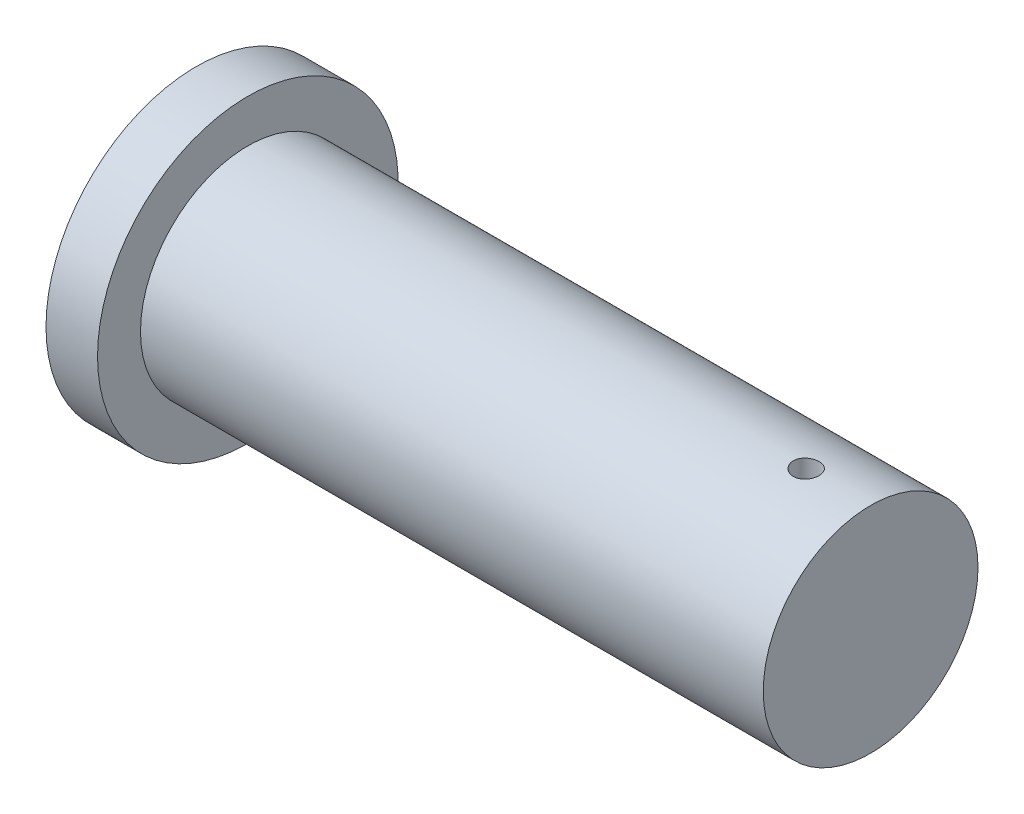
ISO-10303-21;
HEADER;
FILE_DESCRIPTION(('STEP AP214'),'2;1');
FILE_NAME('part.step','',(''),(''),'','','');
FILE_SCHEMA(('AUTOMOTIVE_DESIGN { 1 0 10303 214 1 1 1 1 }'));
ENDSEC;
DATA;
#1=APPLICATION_CONTEXT('core data for automotive mechanical design processes');
#2=APPLICATION_PROTOCOL_DEFINITION('international standard','automotive_design',2000,#1);
#3=PRODUCT_CONTEXT('',#1,'mechanical');
#4=PRODUCT('Part','Part','',(#3));
#5=PRODUCT_RELATED_PRODUCT_CATEGORY('part','',(#4));
#6=PRODUCT_DEFINITION_FORMATION('','',#4);
#7=PRODUCT_DEFINITION_CONTEXT('part definition',#1,'design');
#8=PRODUCT_DEFINITION('design','',#6,#7);
#9=PRODUCT_DEFINITION_SHAPE('','',#8);
#10=(LENGTH_UNIT() NAMED_UNIT(*) SI_UNIT(.MILLI.,.METRE.));
#11=(NAMED_UNIT(*) PLANE_ANGLE_UNIT() SI_UNIT($,.RADIAN.));
#12=(NAMED_UNIT(*) SI_UNIT($,.STERADIAN.) SOLID_ANGLE_UNIT());
#13=UNCERTAINTY_MEASURE_WITH_UNIT(LENGTH_MEASURE(1.E-05),#10,'distance_accuracy_value','');
#14=(GEOMETRIC_REPRESENTATION_CONTEXT(3) GLOBAL_UNCERTAINTY_ASSIGNED_CONTEXT((#13)) GLOBAL_UNIT_ASSIGNED_CONTEXT((#10,
#11,#12)) REPRESENTATION_CONTEXT('',''));
#15=CARTESIAN_POINT('',(0.,0.,0.));
#16=DIRECTION('',(0.,0.,1.));
#17=DIRECTION('',(1.,0.,0.));
#18=AXIS2_PLACEMENT_3D('',#15,#16,#17);
#19=CARTESIAN_POINT('',(0.,0.,0.));
#20=DIRECTION('',(-1.,0.,0.));
#21=DIRECTION('',(0.,0.,1.));
#22=AXIS2_PLACEMENT_3D('',#19,#20,#21);
#23=PLANE('',#22);
#24=CARTESIAN_POINT('',(0.,0.,0.));
#25=DIRECTION('',(-1.,0.,0.));
#26=DIRECTION('',(0.,0.,1.));
#27=AXIS2_PLACEMENT_3D('',#24,#25,#26);
#28=CIRCLE('',#27,25.);
#29=CARTESIAN_POINT('',(0.,0.,25.));
#30=VERTEX_POINT('',#29);
#31=EDGE_CURVE('E10',#30,#30,#28,.T.);
#32=ORIENTED_EDGE('',*,*,#31,.F.);
#33=EDGE_LOOP('',(#32));
#34=FACE_BOUND('',#33,.T.);
#35=ADVANCED_FACE('F37',(#34),#23,.F.);
#36=CARTESIAN_POINT('',(-157.,0.,0.));
#37=DIRECTION('',(-1.,0.,0.));
#38=DIRECTION('',(0.,0.,1.));
#39=AXIS2_PLACEMENT_3D('',#36,#37,#38);
#40=CYLINDRICAL_SURFACE('',#39,25.);
#41=CARTESIAN_POINT('',(-15.,-24.8193472919817,3.));
#42=CARTESIAN_POINT('',(-14.8321408588001,-24.819349617552,2.99999283172714));
#43=CARTESIAN_POINT('',(-14.6641754798502,-24.8210685774632,2.98586413495824));
#44=CARTESIAN_POINT('',(-14.3329153879421,-24.8277564496115,2.92972318709126));
#45=CARTESIAN_POINT('',(-14.1696258043138,-24.8327287982131,2.88768145238964));
#46=CARTESIAN_POINT('',(-13.8525615944955,-24.8453523109071,2.77696834616031));
#47=CARTESIAN_POINT('',(-13.6987807388663,-24.8530016988386,2.708314627898));
#48=CARTESIAN_POINT('',(-13.4049528578966,-24.8701152498661,2.5463633755789));
#49=CARTESIAN_POINT('',(-13.2649034084314,-24.8795790917656,2.45307020212001));
#50=CARTESIAN_POINT('',(-13.0017602283905,-24.8993100054925,2.24397143930053));
#51=CARTESIAN_POINT('',(-12.8787477056516,-24.9095805816582,2.1280639725065));
#52=CARTESIAN_POINT('',(-12.6538712818379,-24.9297361585383,1.87724586434875));
#53=CARTESIAN_POINT('',(-12.5520084140582,-24.9396211403948,1.74233429505413));
#54=CARTESIAN_POINT('',(-12.3720334670638,-24.9579274023081,1.45682956846799));
#55=CARTESIAN_POINT('',(-12.2939945842604,-24.9663441380671,1.306189953849));
#56=CARTESIAN_POINT('',(-12.1643515396153,-24.9807271243236,0.993825767272777));
#57=CARTESIAN_POINT('',(-12.1127464702523,-24.9866934589465,0.832101576085544));
#58=CARTESIAN_POINT('',(-12.0376777438966,-24.9954787324527,0.502987856985085));
#59=CARTESIAN_POINT('',(-12.0140793465542,-24.9983127364408,0.335629471043382));
#60=CARTESIAN_POINT('',(-11.9952764006895,-25.0005654366101,-0.000694496668563025));
#61=CARTESIAN_POINT('',(-12.0000708178418,-24.9999842572034,-0.169660019668337));
#62=CARTESIAN_POINT('',(-12.0378091218514,-24.9954842925266,-0.503485667517528));
#63=CARTESIAN_POINT('',(-12.0706081049724,-24.9915826884338,-0.668362437568211));
#64=CARTESIAN_POINT('',(-12.163198151716,-24.9808996422381,-0.990254370091175));
#65=CARTESIAN_POINT('',(-12.2229896941817,-24.9741181490466,-1.1472693930426));
#66=CARTESIAN_POINT('',(-12.3680227289065,-24.9584077904553,-1.44943112325937));
#67=CARTESIAN_POINT('',(-12.4533272360064,-24.9494736188692,-1.59454729727538));
#68=CARTESIAN_POINT('',(-12.6469188989562,-24.9304580967161,-1.86845892019878));
#69=CARTESIAN_POINT('',(-12.7552070264156,-24.9203766976596,-1.99725367876689));
#70=CARTESIAN_POINT('',(-12.9925043495405,-24.9001206745296,-2.23571721123049));
#71=CARTESIAN_POINT('',(-13.1216397813735,-24.8899458632542,-2.34526038878379));
#72=CARTESIAN_POINT('',(-13.3965315136795,-24.8707126046074,-2.54113591825157));
#73=CARTESIAN_POINT('',(-13.5422878591645,-24.8616541602595,-2.62746820730526));
#74=CARTESIAN_POINT('',(-13.8463924901474,-24.8456792055215,-2.77447678358649));
#75=CARTESIAN_POINT('',(-14.0047454412579,-24.8387634934566,-2.83514351157641));
#76=CARTESIAN_POINT('',(-14.3294923595012,-24.8278728306611,-2.92899010032378));
#77=CARTESIAN_POINT('',(-14.4958859701193,-24.8238977496731,-2.96217117858551));
#78=CARTESIAN_POINT('',(-14.8308830963767,-24.8193620015637,-2.99993928712165));
#79=CARTESIAN_POINT('',(-14.9994664358811,-24.8187802560634,-3.00470284270772));
#80=CARTESIAN_POINT('',(-15.335028780843,-24.8210413301146,-2.98596598055603));
#81=CARTESIAN_POINT('',(-15.5020078176874,-24.82388408253,-2.96246611691249));
#82=CARTESIAN_POINT('',(-15.829095783598,-24.8326546274978,-2.88801791942018));
#83=CARTESIAN_POINT('',(-15.9892243468093,-24.8385728602158,-2.83715462498938));
#84=CARTESIAN_POINT('',(-16.298679282976,-24.8528197853248,-2.70951076792624));
#85=CARTESIAN_POINT('',(-16.4480053045031,-24.8611485560914,-2.63272936258612));
#86=CARTESIAN_POINT('',(-16.7324162949746,-24.8793287313299,-2.45499302721611));
#87=CARTESIAN_POINT('',(-16.8674282868813,-24.8891873609855,-2.35392207141476));
#88=CARTESIAN_POINT('',(-17.1186351130118,-24.9092935540369,-2.13064017836707));
#89=CARTESIAN_POINT('',(-17.2348292734059,-24.9195411313438,-2.00842848443621));
#90=CARTESIAN_POINT('',(-17.4457197472349,-24.939335094491,-1.74556427266772));
#91=CARTESIAN_POINT('',(-17.5403002465114,-24.948877525603,-1.60481849941783));
#92=CARTESIAN_POINT('',(-17.7044782093291,-24.966127243116,-1.30933642941058));
#93=CARTESIAN_POINT('',(-17.7740761423745,-24.9738345640037,-1.15460039564442));
#94=CARTESIAN_POINT('',(-17.8861210048758,-24.9865280430514,-0.835919244719989));
#95=CARTESIAN_POINT('',(-17.9286355198843,-24.9915209702628,-0.671998170647185));
#96=CARTESIAN_POINT('',(-17.9855267435822,-24.9982511364507,-0.339280584991481));
#97=CARTESIAN_POINT('',(-17.9999046166931,-24.9999885101567,-0.170484275461262));
#98=CARTESIAN_POINT('',(-18.0000938441123,-25.0000113048646,0.166060006255654));
#99=CARTESIAN_POINT('',(-17.9860840366833,-24.9983183365244,0.33380790465886));
#100=CARTESIAN_POINT('',(-17.9302735450975,-24.9917135402075,0.66454722479624));
#101=CARTESIAN_POINT('',(-17.8884728700504,-24.9868017132859,0.827538648089516));
#102=CARTESIAN_POINT('',(-17.7783219848685,-24.9743088019473,1.14411955598358));
#103=CARTESIAN_POINT('',(-17.7099796355458,-24.9667285079087,1.29771180874788));
#104=CARTESIAN_POINT('',(-17.5487039304154,-24.9497392443223,1.59127541052543));
#105=CARTESIAN_POINT('',(-17.4557703755962,-24.9403302599753,1.73124664929414));
#106=CARTESIAN_POINT('',(-17.2472863179947,-24.920663936203,1.99450948424813));
#107=CARTESIAN_POINT('',(-17.1316026446779,-24.910401817522,2.11769526787512));
#108=CARTESIAN_POINT('',(-16.8811769628439,-24.8902246865463,2.34297730712577));
#109=CARTESIAN_POINT('',(-16.7464304354851,-24.88030975725,2.44506854813714));
#110=CARTESIAN_POINT('',(-16.461157063841,-24.8619119204259,2.62557074728252));
#111=CARTESIAN_POINT('',(-16.3105756717734,-24.8534342444192,2.70389598198192));
#112=CARTESIAN_POINT('',(-15.998382246296,-24.8389322365013,2.8340380582164));
#113=CARTESIAN_POINT('',(-15.8367825288145,-24.8329052161653,2.88588396425552));
#114=CARTESIAN_POINT('',(-15.5619404608884,-24.8254627238532,2.94907010073915));
#115=CARTESIAN_POINT('',(-15.4504372480377,-24.8231807309863,2.96814164942006));
#116=CARTESIAN_POINT('',(-15.2259720678681,-24.8201222373143,2.99360896909453));
#117=CARTESIAN_POINT('',(-15.1130101104407,-24.8193457263061,3.00000482599459));
#118=CARTESIAN_POINT('',(-15.,-24.8193472919817,3.));
#119=B_SPLINE_CURVE_WITH_KNOTS('',3,(#41,#42,#43,#44,#45,#46,#47,#48,#49,#50,#51,#52,#53,#54,
#55,#56,#57,#58,#59,#60,#61,#62,#63,#64,#65,#66,#67,#68,#69,#70,#71,#72,#73,#74,#75,#76,#77,#78,
#79,#80,#81,#82,#83,#84,#85,#86,#87,#88,#89,#90,#91,#92,#93,#94,#95,#96,#97,#98,#99,#100,#101,
#102,#103,#104,#105,#106,#107,#108,#109,#110,#111,#112,#113,#114,#115,#116,#117,#118),
.UNSPECIFIED.,.T.,.F.,(4,2,2,2,2,2,2,2,2,2,2,2,2,2,2,2,2,2,2,2,2,2,2,2,2,2,2,2,2,2,2,2,2,2,2,2,
2,2,4),(0.,0.503164613232923,1.00686154966524,1.51022492507114,2.01349927674882,
2.51909553323416,3.02471648549883,3.53187561756201,4.03901733675556,4.54370917218766,
5.04838262225285,5.5504604616135,6.05254720809333,6.55588445357933,7.05924298138499,
7.56577244411506,8.0723032786378,8.5790226067925,9.08571948810824,9.58926554088958,
10.0928017219916,10.5947819896887,11.0967785804672,11.6012225031328,12.105684484956,
12.6127892929794,13.119884570345,13.6257094034364,14.1315133027652,14.6341406188081,
15.1367677700954,15.6392461723566,16.1417286411941,16.6472450412647,17.1528814752089,
17.6603206216507,18.1672015841626,18.5059562893408,18.8447086986815),.UNSPECIFIED.);
#120=CARTESIAN_POINT('',(-15.,-24.8193472919817,3.));
#121=VERTEX_POINT('',#120);
#122=EDGE_CURVE('E40',#121,#121,#119,.T.);
#123=ORIENTED_EDGE('',*,*,#122,.T.);
#124=EDGE_LOOP('',(#123));
#125=FACE_BOUND('',#124,.T.);
#126=CARTESIAN_POINT('',(-15.,24.8193472919817,3.));
#127=CARTESIAN_POINT('',(-15.1678591411999,24.819349617552,2.99999283172714));
#128=CARTESIAN_POINT('',(-15.3358245201499,24.8210685774632,2.98586413495824));
#129=CARTESIAN_POINT('',(-15.6670846120579,24.8277564496115,2.92972318709126));
#130=CARTESIAN_POINT('',(-15.8303741956863,24.8327287982131,2.88768145238964));
#131=CARTESIAN_POINT('',(-16.1474384055045,24.8453523109071,2.77696834616031));
#132=CARTESIAN_POINT('',(-16.3012192611337,24.8530016988386,2.708314627898));
#133=CARTESIAN_POINT('',(-16.5950471421035,24.8701152498661,2.5463633755789));
#134=CARTESIAN_POINT('',(-16.7350965915686,24.8795790917656,2.45307020212001));
#135=CARTESIAN_POINT('',(-16.9982397716095,24.8993100054925,2.24397143930053));
#136=CARTESIAN_POINT('',(-17.1212522943484,24.9095805816582,2.1280639725065));
#137=CARTESIAN_POINT('',(-17.3461287181621,24.9297361585383,1.87724586434875));
#138=CARTESIAN_POINT('',(-17.4479915859419,24.9396211403948,1.74233429505413));
#139=CARTESIAN_POINT('',(-17.6279665329362,24.9579274023081,1.45682956846799));
#140=CARTESIAN_POINT('',(-17.7060054157396,24.9663441380671,1.30618995384899));
#141=CARTESIAN_POINT('',(-17.8356484603848,24.9807271243236,0.993825767272775));
#142=CARTESIAN_POINT('',(-17.8872535297477,24.9866934589465,0.832101576085542));
#143=CARTESIAN_POINT('',(-17.9623222561035,24.9954787324527,0.502987856985085));
#144=CARTESIAN_POINT('',(-17.9859206534458,24.9983127364408,0.335629471043381));
#145=CARTESIAN_POINT('',(-18.0047235993105,25.0005654366101,-0.000694496668563133));
#146=CARTESIAN_POINT('',(-17.9999291821582,24.9999842572034,-0.169660019668337));
#147=CARTESIAN_POINT('',(-17.9621908781487,24.9954842925266,-0.503485667517528));
#148=CARTESIAN_POINT('',(-17.9293918950276,24.9915826884338,-0.668362437568211));
#149=CARTESIAN_POINT('',(-17.836801848284,24.9808996422381,-0.990254370091175));
#150=CARTESIAN_POINT('',(-17.7770103058184,24.9741181490466,-1.1472693930426));
#151=CARTESIAN_POINT('',(-17.6319772710935,24.9584077904553,-1.44943112325937));
#152=CARTESIAN_POINT('',(-17.5466727639936,24.9494736188692,-1.59454729727538));
#153=CARTESIAN_POINT('',(-17.3530811010439,24.9304580967161,-1.86845892019878));
#154=CARTESIAN_POINT('',(-17.2447929735844,24.9203766976596,-1.99725367876689));
#155=CARTESIAN_POINT('',(-17.0074956504596,24.9001206745296,-2.23571721123049));
#156=CARTESIAN_POINT('',(-16.8783602186265,24.8899458632542,-2.34526038878379));
#157=CARTESIAN_POINT('',(-16.6034684863205,24.8707126046074,-2.54113591825157));
#158=CARTESIAN_POINT('',(-16.4577121408355,24.8616541602595,-2.62746820730526));
#159=CARTESIAN_POINT('',(-16.1536075098526,24.8456792055215,-2.7744767835865));
#160=CARTESIAN_POINT('',(-15.9952545587421,24.8387634934566,-2.83514351157641));
#161=CARTESIAN_POINT('',(-15.6705076404988,24.8278728306611,-2.92899010032378));
#162=CARTESIAN_POINT('',(-15.5041140298807,24.8238977496731,-2.96217117858551));
#163=CARTESIAN_POINT('',(-15.1691169036233,24.8193620015637,-2.99993928712165));
#164=CARTESIAN_POINT('',(-15.0005335641189,24.8187802560634,-3.00470284270772));
#165=CARTESIAN_POINT('',(-14.6649712191571,24.8210413301146,-2.98596598055603));
#166=CARTESIAN_POINT('',(-14.4979921823126,24.82388408253,-2.96246611691249));
#167=CARTESIAN_POINT('',(-14.170904216402,24.8326546274978,-2.88801791942018));
#168=CARTESIAN_POINT('',(-14.0107756531907,24.8385728602158,-2.83715462498938));
#169=CARTESIAN_POINT('',(-13.7013207170241,24.8528197853248,-2.70951076792624));
#170=CARTESIAN_POINT('',(-13.551994695497,24.8611485560914,-2.63272936258612));
#171=CARTESIAN_POINT('',(-13.2675837050254,24.8793287313299,-2.45499302721611));
#172=CARTESIAN_POINT('',(-13.1325717131187,24.8891873609855,-2.35392207141476));
#173=CARTESIAN_POINT('',(-12.8813648869882,24.9092935540369,-2.13064017836707));
#174=CARTESIAN_POINT('',(-12.7651707265941,24.9195411313438,-2.00842848443621));
#175=CARTESIAN_POINT('',(-12.5542802527651,24.939335094491,-1.74556427266772));
#176=CARTESIAN_POINT('',(-12.4596997534886,24.948877525603,-1.60481849941784));
#177=CARTESIAN_POINT('',(-12.2955217906709,24.966127243116,-1.30933642941058));
#178=CARTESIAN_POINT('',(-12.2259238576256,24.9738345640037,-1.15460039564442));
#179=CARTESIAN_POINT('',(-12.1138789951242,24.9865280430514,-0.835919244719987));
#180=CARTESIAN_POINT('',(-12.0713644801158,24.9915209702628,-0.671998170647183));
#181=CARTESIAN_POINT('',(-12.0144732564179,24.9982511364507,-0.339280584991478));
#182=CARTESIAN_POINT('',(-12.0000953833069,24.9999885101567,-0.17048427546126));
#183=CARTESIAN_POINT('',(-11.9999061558877,25.0000113048646,0.166060006255656));
#184=CARTESIAN_POINT('',(-12.0139159633168,24.9983183365244,0.333807904658862));
#185=CARTESIAN_POINT('',(-12.0697264549025,24.9917135402075,0.664547224796242));
#186=CARTESIAN_POINT('',(-12.1115271299496,24.9868017132859,0.827538648089518));
#187=CARTESIAN_POINT('',(-12.2216780151315,24.9743088019473,1.14411955598358));
#188=CARTESIAN_POINT('',(-12.2900203644542,24.9667285079087,1.29771180874788));
#189=CARTESIAN_POINT('',(-12.4512960695847,24.9497392443223,1.59127541052543));
#190=CARTESIAN_POINT('',(-12.5442296244038,24.9403302599753,1.73124664929415));
#191=CARTESIAN_POINT('',(-12.7527136820053,24.920663936203,1.99450948424813));
#192=CARTESIAN_POINT('',(-12.8683973553221,24.910401817522,2.11769526787512));
#193=CARTESIAN_POINT('',(-13.1188230371561,24.8902246865463,2.34297730712577));
#194=CARTESIAN_POINT('',(-13.2535695645149,24.88030975725,2.44506854813714));
#195=CARTESIAN_POINT('',(-13.538842936159,24.8619119204259,2.62557074728252));
#196=CARTESIAN_POINT('',(-13.6894243282266,24.8534342444192,2.70389598198192));
#197=CARTESIAN_POINT('',(-14.0016177537041,24.8389322365013,2.8340380582164));
#198=CARTESIAN_POINT('',(-14.1632174711855,24.8329052161653,2.88588396425552));
#199=CARTESIAN_POINT('',(-14.4380595391116,24.8254627238532,2.94907010073915));
#200=CARTESIAN_POINT('',(-14.5495627519623,24.8231807309863,2.96814164942006));
#201=CARTESIAN_POINT('',(-14.7740279321319,24.8201222373143,2.99360896909453));
#202=CARTESIAN_POINT('',(-14.8869898895593,24.8193457263061,3.00000482599459));
#203=CARTESIAN_POINT('',(-15.,24.8193472919817,3.));
#204=B_SPLINE_CURVE_WITH_KNOTS('',3,(#126,#127,#128,#129,#130,#131,#132,#133,#134,#135,#136,
#137,#138,#139,#140,#141,#142,#143,#144,#145,#146,#147,#148,#149,#150,#151,#152,#153,#154,#155,
#156,#157,#158,#159,#160,#161,#162,#163,#164,#165,#166,#167,#168,#169,#170,#171,#172,#173,#174,
#175,#176,#177,#178,#179,#180,#181,#182,#183,#184,#185,#186,#187,#188,#189,#190,#191,#192,#193,
#194,#195,#196,#197,#198,#199,#200,#201,#202,#203),.UNSPECIFIED.,.T.,.F.,(4,2,2,2,2,2,2,2,2,2,2,
2,2,2,2,2,2,2,2,2,2,2,2,2,2,2,2,2,2,2,2,2,2,2,2,2,2,2,4),(0.,0.503164613232923,1.00686154966524,
1.51022492507114,2.01349927674882,2.51909553323416,3.02471648549883,3.53187561756201,
4.03901733675556,4.54370917218765,5.04838262225285,5.55046046161349,6.05254720809332,
6.55588445357933,7.05924298138499,7.56577244411506,8.0723032786378,8.5790226067925,
9.08571948810824,9.58926554088958,10.0928017219916,10.5947819896887,11.0967785804672,
11.6012225031328,12.105684484956,12.6127892929794,13.119884570345,13.6257094034364,
14.1315133027652,14.6341406188081,15.1367677700954,15.6392461723566,16.1417286411941,
16.6472450412647,17.1528814752089,17.6603206216507,18.1672015841626,18.5059562893408,
18.8447086986815),.UNSPECIFIED.);
#205=CARTESIAN_POINT('',(-15.,24.8193472919817,3.));
#206=VERTEX_POINT('',#205);
#207=EDGE_CURVE('E56',#206,#206,#204,.T.);
#208=ORIENTED_EDGE('',*,*,#207,.T.);
#209=EDGE_LOOP('',(#208));
#210=FACE_BOUND('',#209,.T.);
#211=CARTESIAN_POINT('',(-145.,0.,0.));
#212=DIRECTION('',(-1.,0.,0.));
#213=DIRECTION('',(0.,0.,1.));
#214=AXIS2_PLACEMENT_3D('',#211,#212,#213);
#215=CIRCLE('',#214,25.);
#216=CARTESIAN_POINT('',(-145.,0.,25.));
#217=VERTEX_POINT('',#216);
#218=EDGE_CURVE('E48',#217,#217,#215,.T.);
#219=ORIENTED_EDGE('',*,*,#218,.F.);
#220=EDGE_LOOP('',(#219));
#221=FACE_BOUND('',#220,.T.);
#222=ORIENTED_EDGE('',*,*,#31,.T.);
#223=EDGE_LOOP('',(#222));
#224=FACE_BOUND('',#223,.T.);
#225=ADVANCED_FACE('F61',(#125,#210,#221,#224),#40,.T.);
#226=CARTESIAN_POINT('',(-145.,25.,0.));
#227=DIRECTION('',(-1.,0.,0.));
#228=DIRECTION('',(0.,0.,1.));
#229=AXIS2_PLACEMENT_3D('',#226,#227,#228);
#230=PLANE('',#229);
#231=CARTESIAN_POINT('',(-145.,0.,0.));
#232=DIRECTION('',(-1.,0.,0.));
#233=DIRECTION('',(0.,0.,1.));
#234=AXIS2_PLACEMENT_3D('',#231,#232,#233);
#235=CIRCLE('',#234,35.);
#236=CARTESIAN_POINT('',(-145.,0.,35.));
#237=VERTEX_POINT('',#236);
#238=EDGE_CURVE('E53',#237,#237,#235,.T.);
#239=ORIENTED_EDGE('',*,*,#238,.F.);
#240=EDGE_LOOP('',(#239));
#241=FACE_BOUND('',#240,.T.);
#242=ORIENTED_EDGE('',*,*,#218,.T.);
#243=EDGE_LOOP('',(#242));
#244=FACE_BOUND('',#243,.T.);
#245=ADVANCED_FACE('F76',(#241,#244),#230,.F.);
#246=CARTESIAN_POINT('',(-157.,0.,0.));
#247=DIRECTION('',(-1.,0.,0.));
#248=DIRECTION('',(0.,0.,1.));
#249=AXIS2_PLACEMENT_3D('',#246,#247,#248);
#250=CYLINDRICAL_SURFACE('',#249,35.);
#251=CARTESIAN_POINT('',(-157.,0.,0.));
#252=DIRECTION('',(-1.,0.,0.));
#253=DIRECTION('',(0.,0.,1.));
#254=AXIS2_PLACEMENT_3D('',#251,#252,#253);
#255=CIRCLE('',#254,35.);
#256=CARTESIAN_POINT('',(-157.,0.,35.));
#257=VERTEX_POINT('',#256);
#258=EDGE_CURVE('E126',#257,#257,#255,.T.);
#259=ORIENTED_EDGE('',*,*,#258,.F.);
#260=EDGE_LOOP('',(#259));
#261=FACE_BOUND('',#260,.T.);
#262=ORIENTED_EDGE('',*,*,#238,.T.);
#263=EDGE_LOOP('',(#262));
#264=FACE_BOUND('',#263,.T.);
#265=ADVANCED_FACE('F73',(#261,#264),#250,.T.);
#266=CARTESIAN_POINT('',(-157.,35.,0.));
#267=DIRECTION('',(1.,0.,0.));
#268=DIRECTION('',(0.,0.,-1.));
#269=AXIS2_PLACEMENT_3D('',#266,#267,#268);
#270=PLANE('',#269);
#271=ORIENTED_EDGE('',*,*,#258,.T.);
#272=EDGE_LOOP('',(#271));
#273=FACE_BOUND('',#272,.T.);
#274=ADVANCED_FACE('F68',(#273),#270,.F.);
#275=CARTESIAN_POINT('',(-15.,-35.,0.));
#276=DIRECTION('',(0.,1.,0.));
#277=DIRECTION('',(0.,0.,1.));
#278=AXIS2_PLACEMENT_3D('',#275,#276,#277);
#279=CYLINDRICAL_SURFACE('',#278,3.);
#280=ORIENTED_EDGE('',*,*,#207,.F.);
#281=EDGE_LOOP('',(#280));
#282=FACE_BOUND('',#281,.T.);
#283=ORIENTED_EDGE('',*,*,#122,.F.);
#284=EDGE_LOOP('',(#283));
#285=FACE_BOUND('',#284,.T.);
#286=ADVANCED_FACE('F64',(#282,#285),#279,.F.);
#287=CLOSED_SHELL('',(#35,#225,#245,#265,#274,#286));
#288=MANIFOLD_SOLID_BREP('B2',#287);
#289=ADVANCED_BREP_SHAPE_REPRESENTATION('',(#18,#288),#14);
#290=SHAPE_DEFINITION_REPRESENTATION(#9,#289);
ENDSEC;
END-ISO-10303-21;
